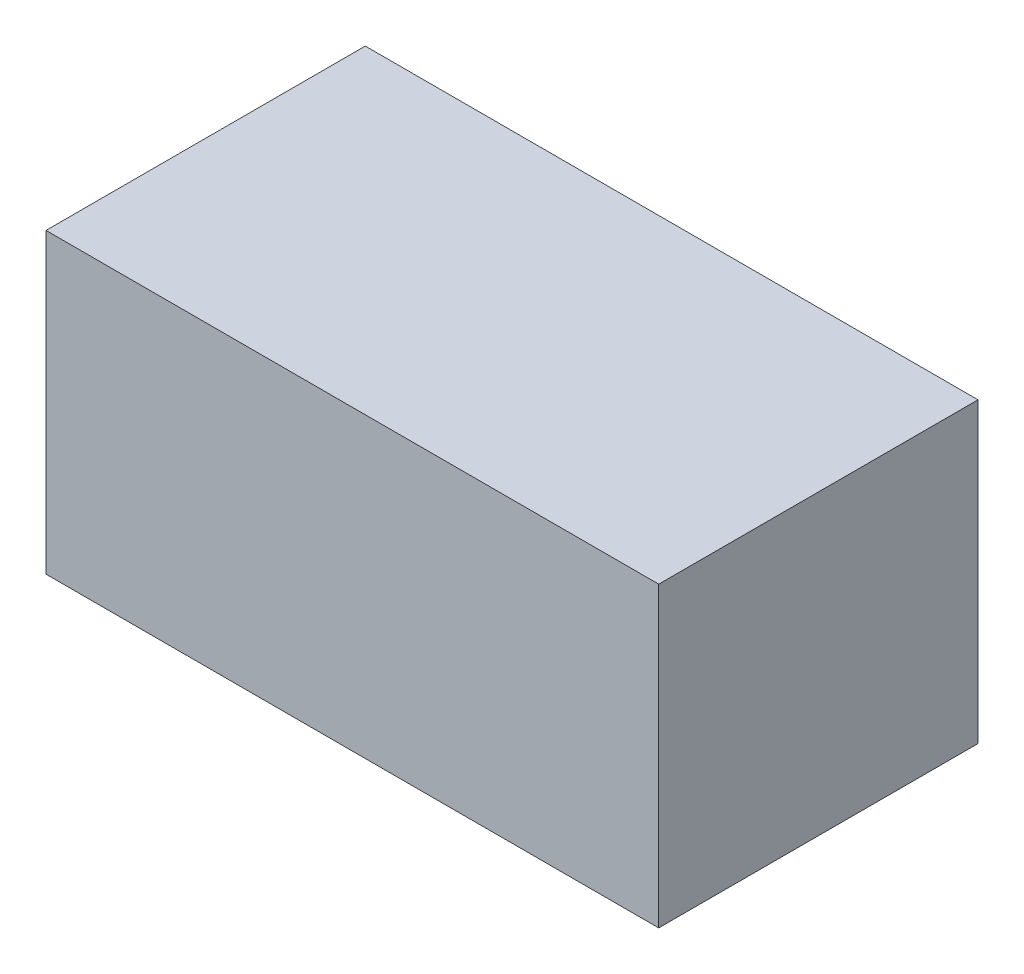
ISO-10303-21;
HEADER;
FILE_DESCRIPTION(('STEP AP214'),'2;1');
FILE_NAME('part.step','',(''),(''),'','','');
FILE_SCHEMA(('AUTOMOTIVE_DESIGN { 1 0 10303 214 1 1 1 1 }'));
ENDSEC;
DATA;
#1=APPLICATION_CONTEXT('core data for automotive mechanical design processes');
#2=APPLICATION_PROTOCOL_DEFINITION('international standard','automotive_design',2000,#1);
#3=PRODUCT_CONTEXT('',#1,'mechanical');
#4=PRODUCT('Part','Part','',(#3));
#5=PRODUCT_RELATED_PRODUCT_CATEGORY('part','',(#4));
#6=PRODUCT_DEFINITION_FORMATION('','',#4);
#7=PRODUCT_DEFINITION_CONTEXT('part definition',#1,'design');
#8=PRODUCT_DEFINITION('design','',#6,#7);
#9=PRODUCT_DEFINITION_SHAPE('','',#8);
#10=(LENGTH_UNIT() NAMED_UNIT(*) SI_UNIT(.MILLI.,.METRE.));
#11=(NAMED_UNIT(*) PLANE_ANGLE_UNIT() SI_UNIT($,.RADIAN.));
#12=(NAMED_UNIT(*) SI_UNIT($,.STERADIAN.) SOLID_ANGLE_UNIT());
#13=UNCERTAINTY_MEASURE_WITH_UNIT(LENGTH_MEASURE(1.E-05),#10,'distance_accuracy_value','');
#14=(GEOMETRIC_REPRESENTATION_CONTEXT(3) GLOBAL_UNCERTAINTY_ASSIGNED_CONTEXT((#13)) GLOBAL_UNIT_ASSIGNED_CONTEXT((#10,
#11,#12)) REPRESENTATION_CONTEXT('',''));
#15=CARTESIAN_POINT('',(0.,0.,0.));
#16=DIRECTION('',(0.,0.,1.));
#17=DIRECTION('',(1.,0.,0.));
#18=AXIS2_PLACEMENT_3D('',#15,#16,#17);
#19=CARTESIAN_POINT('',(35.5,34.5,-18.5));
#20=DIRECTION('',(-1.,0.,0.));
#21=DIRECTION('',(0.,0.,1.));
#22=AXIS2_PLACEMENT_3D('',#19,#20,#21);
#23=PLANE('',#22);
#24=DIRECTION('',(0.,0.,-1.));
#25=VECTOR('',#24,1.);
#26=CARTESIAN_POINT('',(35.5,0.,-18.5));
#27=LINE('',#26,#25);
#28=CARTESIAN_POINT('',(35.5,0.,18.5));
#29=VERTEX_POINT('',#28);
#30=CARTESIAN_POINT('',(35.5,0.,-18.5));
#31=VERTEX_POINT('',#30);
#32=EDGE_CURVE('E103',#29,#31,#27,.T.);
#33=ORIENTED_EDGE('',*,*,#32,.T.);
#34=DIRECTION('',(0.,-1.,0.));
#35=VECTOR('',#34,1.);
#36=CARTESIAN_POINT('',(35.5,34.5,-18.5));
#37=LINE('',#36,#35);
#38=CARTESIAN_POINT('',(35.5,34.5,-18.5));
#39=VERTEX_POINT('',#38);
#40=EDGE_CURVE('E11',#39,#31,#37,.T.);
#41=ORIENTED_EDGE('',*,*,#40,.F.);
#42=DIRECTION('',(0.,0.,-1.));
#43=VECTOR('',#42,1.);
#44=CARTESIAN_POINT('',(35.5,34.5,-18.5));
#45=LINE('',#44,#43);
#46=CARTESIAN_POINT('',(35.5,34.5,18.5));
#47=VERTEX_POINT('',#46);
#48=EDGE_CURVE('E91',#47,#39,#45,.T.);
#49=ORIENTED_EDGE('',*,*,#48,.F.);
#50=DIRECTION('',(0.,-1.,0.));
#51=VECTOR('',#50,1.);
#52=CARTESIAN_POINT('',(35.5,34.5,18.5));
#53=LINE('',#52,#51);
#54=EDGE_CURVE('E99',#47,#29,#53,.T.);
#55=ORIENTED_EDGE('',*,*,#54,.T.);
#56=EDGE_LOOP('',(#33,#41,#49,#55));
#57=FACE_BOUND('',#56,.T.);
#58=ADVANCED_FACE('F40',(#57),#23,.F.);
#59=CARTESIAN_POINT('',(-35.5,34.5,-18.5));
#60=DIRECTION('',(0.,0.,1.));
#61=DIRECTION('',(1.,0.,0.));
#62=AXIS2_PLACEMENT_3D('',#59,#60,#61);
#63=PLANE('',#62);
#64=DIRECTION('',(-1.,0.,0.));
#65=VECTOR('',#64,1.);
#66=CARTESIAN_POINT('',(-35.5,0.,-18.5));
#67=LINE('',#66,#65);
#68=CARTESIAN_POINT('',(-35.5,0.,-18.5));
#69=VERTEX_POINT('',#68);
#70=EDGE_CURVE('E95',#31,#69,#67,.T.);
#71=ORIENTED_EDGE('',*,*,#70,.T.);
#72=DIRECTION('',(0.,-1.,0.));
#73=VECTOR('',#72,1.);
#74=CARTESIAN_POINT('',(-35.5,34.5,-18.5));
#75=LINE('',#74,#73);
#76=CARTESIAN_POINT('',(-35.5,34.5,-18.5));
#77=VERTEX_POINT('',#76);
#78=EDGE_CURVE('E48',#77,#69,#75,.T.);
#79=ORIENTED_EDGE('',*,*,#78,.F.);
#80=DIRECTION('',(-1.,0.,0.));
#81=VECTOR('',#80,1.);
#82=CARTESIAN_POINT('',(-35.5,34.5,-18.5));
#83=LINE('',#82,#81);
#84=EDGE_CURVE('E86',#39,#77,#83,.T.);
#85=ORIENTED_EDGE('',*,*,#84,.F.);
#86=ORIENTED_EDGE('',*,*,#40,.T.);
#87=EDGE_LOOP('',(#71,#79,#85,#86));
#88=FACE_BOUND('',#87,.T.);
#89=ADVANCED_FACE('F94',(#88),#63,.F.);
#90=CARTESIAN_POINT('',(-35.5,34.5,-18.5));
#91=DIRECTION('',(1.,0.,0.));
#92=DIRECTION('',(0.,0.,-1.));
#93=AXIS2_PLACEMENT_3D('',#90,#91,#92);
#94=PLANE('',#93);
#95=DIRECTION('',(0.,0.,1.));
#96=VECTOR('',#95,1.);
#97=CARTESIAN_POINT('',(-35.5,0.,-18.5));
#98=LINE('',#97,#96);
#99=CARTESIAN_POINT('',(-35.5,0.,18.5));
#100=VERTEX_POINT('',#99);
#101=EDGE_CURVE('E73',#69,#100,#98,.T.);
#102=ORIENTED_EDGE('',*,*,#101,.T.);
#103=DIRECTION('',(0.,-1.,0.));
#104=VECTOR('',#103,1.);
#105=CARTESIAN_POINT('',(-35.5,34.5,18.5));
#106=LINE('',#105,#104);
#107=CARTESIAN_POINT('',(-35.5,34.5,18.5));
#108=VERTEX_POINT('',#107);
#109=EDGE_CURVE('E96',#108,#100,#106,.T.);
#110=ORIENTED_EDGE('',*,*,#109,.F.);
#111=DIRECTION('',(0.,0.,1.));
#112=VECTOR('',#111,1.);
#113=CARTESIAN_POINT('',(-35.5,34.5,-18.5));
#114=LINE('',#113,#112);
#115=EDGE_CURVE('E89',#77,#108,#114,.T.);
#116=ORIENTED_EDGE('',*,*,#115,.F.);
#117=ORIENTED_EDGE('',*,*,#78,.T.);
#118=EDGE_LOOP('',(#102,#110,#116,#117));
#119=FACE_BOUND('',#118,.T.);
#120=ADVANCED_FACE('F97',(#119),#94,.F.);
#121=CARTESIAN_POINT('',(-35.5,34.5,18.5));
#122=DIRECTION('',(0.,0.,-1.));
#123=DIRECTION('',(-1.,0.,0.));
#124=AXIS2_PLACEMENT_3D('',#121,#122,#123);
#125=PLANE('',#124);
#126=DIRECTION('',(1.,0.,0.));
#127=VECTOR('',#126,1.);
#128=CARTESIAN_POINT('',(-35.5,0.,18.5));
#129=LINE('',#128,#127);
#130=EDGE_CURVE('E79',#100,#29,#129,.T.);
#131=ORIENTED_EDGE('',*,*,#130,.T.);
#132=ORIENTED_EDGE('',*,*,#54,.F.);
#133=DIRECTION('',(1.,0.,0.));
#134=VECTOR('',#133,1.);
#135=CARTESIAN_POINT('',(-35.5,34.5,18.5));
#136=LINE('',#135,#134);
#137=EDGE_CURVE('E56',#108,#47,#136,.T.);
#138=ORIENTED_EDGE('',*,*,#137,.F.);
#139=ORIENTED_EDGE('',*,*,#109,.T.);
#140=EDGE_LOOP('',(#131,#132,#138,#139));
#141=FACE_BOUND('',#140,.T.);
#142=ADVANCED_FACE('F110',(#141),#125,.F.);
#143=CARTESIAN_POINT('',(0.,34.5,0.));
#144=DIRECTION('',(0.,1.,0.));
#145=DIRECTION('',(0.,0.,1.));
#146=AXIS2_PLACEMENT_3D('',#143,#144,#145);
#147=PLANE('',#146);
#148=ORIENTED_EDGE('',*,*,#48,.T.);
#149=ORIENTED_EDGE('',*,*,#84,.T.);
#150=ORIENTED_EDGE('',*,*,#115,.T.);
#151=ORIENTED_EDGE('',*,*,#137,.T.);
#152=EDGE_LOOP('',(#148,#149,#150,#151));
#153=FACE_BOUND('',#152,.T.);
#154=ADVANCED_FACE('F87',(#153),#147,.T.);
#155=CARTESIAN_POINT('',(0.,0.,0.));
#156=DIRECTION('',(0.,1.,0.));
#157=DIRECTION('',(0.,0.,1.));
#158=AXIS2_PLACEMENT_3D('',#155,#156,#157);
#159=PLANE('',#158);
#160=ORIENTED_EDGE('',*,*,#32,.F.);
#161=ORIENTED_EDGE('',*,*,#130,.F.);
#162=ORIENTED_EDGE('',*,*,#101,.F.);
#163=ORIENTED_EDGE('',*,*,#70,.F.);
#164=EDGE_LOOP('',(#160,#161,#162,#163));
#165=FACE_BOUND('',#164,.T.);
#166=ADVANCED_FACE('F113',(#165),#159,.F.);
#167=CLOSED_SHELL('',(#58,#89,#120,#142,#154,#166));
#168=MANIFOLD_SOLID_BREP('B2',#167);
#169=ADVANCED_BREP_SHAPE_REPRESENTATION('',(#18,#168),#14);
#170=SHAPE_DEFINITION_REPRESENTATION(#9,#169);
ENDSEC;
END-ISO-10303-21;
